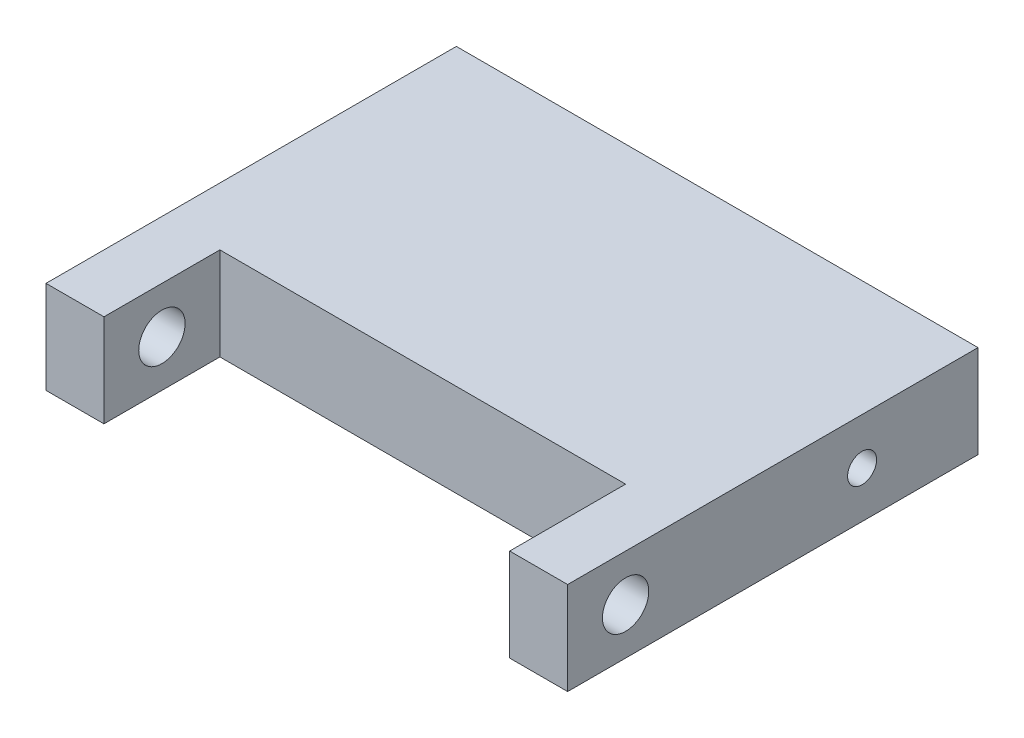
ISO-10303-21;
HEADER;
FILE_DESCRIPTION(('STEP AP214'),'2;1');
FILE_NAME('part.step','',(''),(''),'','','');
FILE_SCHEMA(('AUTOMOTIVE_DESIGN { 1 0 10303 214 1 1 1 1 }'));
ENDSEC;
DATA;
#1=APPLICATION_CONTEXT('core data for automotive mechanical design processes');
#2=APPLICATION_PROTOCOL_DEFINITION('international standard','automotive_design',2000,#1);
#3=PRODUCT_CONTEXT('',#1,'mechanical');
#4=PRODUCT('Part','Part','',(#3));
#5=PRODUCT_RELATED_PRODUCT_CATEGORY('part','',(#4));
#6=PRODUCT_DEFINITION_FORMATION('','',#4);
#7=PRODUCT_DEFINITION_CONTEXT('part definition',#1,'design');
#8=PRODUCT_DEFINITION('design','',#6,#7);
#9=PRODUCT_DEFINITION_SHAPE('','',#8);
#10=(LENGTH_UNIT() NAMED_UNIT(*) SI_UNIT(.MILLI.,.METRE.));
#11=(NAMED_UNIT(*) PLANE_ANGLE_UNIT() SI_UNIT($,.RADIAN.));
#12=(NAMED_UNIT(*) SI_UNIT($,.STERADIAN.) SOLID_ANGLE_UNIT());
#13=UNCERTAINTY_MEASURE_WITH_UNIT(LENGTH_MEASURE(1.E-05),#10,'distance_accuracy_value','');
#14=(GEOMETRIC_REPRESENTATION_CONTEXT(3) GLOBAL_UNCERTAINTY_ASSIGNED_CONTEXT((#13)) GLOBAL_UNIT_ASSIGNED_CONTEXT((#10,
#11,#12)) REPRESENTATION_CONTEXT('',''));
#15=CARTESIAN_POINT('',(0.,0.,0.));
#16=DIRECTION('',(0.,0.,1.));
#17=DIRECTION('',(1.,0.,0.));
#18=AXIS2_PLACEMENT_3D('',#15,#16,#17);
#19=CARTESIAN_POINT('',(0.,8.,0.));
#20=DIRECTION('',(0.,0.,-1.));
#21=DIRECTION('',(-1.,0.,0.));
#22=AXIS2_PLACEMENT_3D('',#19,#20,#21);
#23=PLANE('',#22);
#24=DIRECTION('',(0.,1.,0.));
#25=VECTOR('',#24,1.);
#26=CARTESIAN_POINT('',(5.,0.,0.));
#27=LINE('',#26,#25);
#28=CARTESIAN_POINT('',(5.,0.,0.));
#29=VERTEX_POINT('',#28);
#30=CARTESIAN_POINT('',(5.,8.,0.));
#31=VERTEX_POINT('',#30);
#32=EDGE_CURVE('E118',#29,#31,#27,.T.);
#33=ORIENTED_EDGE('',*,*,#32,.F.);
#34=DIRECTION('',(1.,0.,0.));
#35=VECTOR('',#34,1.);
#36=CARTESIAN_POINT('',(0.,0.,0.));
#37=LINE('',#36,#35);
#38=CARTESIAN_POINT('',(40.,0.,0.));
#39=VERTEX_POINT('',#38);
#40=EDGE_CURVE('E160',#29,#39,#37,.T.);
#41=ORIENTED_EDGE('',*,*,#40,.T.);
#42=DIRECTION('',(0.,-1.,0.));
#43=VECTOR('',#42,1.);
#44=CARTESIAN_POINT('',(40.,0.,0.));
#45=LINE('',#44,#43);
#46=CARTESIAN_POINT('',(40.,8.,0.));
#47=VERTEX_POINT('',#46);
#48=EDGE_CURVE('E132',#47,#39,#45,.T.);
#49=ORIENTED_EDGE('',*,*,#48,.F.);
#50=DIRECTION('',(1.,0.,0.));
#51=VECTOR('',#50,1.);
#52=CARTESIAN_POINT('',(0.,8.,0.));
#53=LINE('',#52,#51);
#54=EDGE_CURVE('E50',#31,#47,#53,.T.);
#55=ORIENTED_EDGE('',*,*,#54,.F.);
#56=EDGE_LOOP('',(#33,#41,#49,#55));
#57=FACE_BOUND('',#56,.T.);
#58=ADVANCED_FACE('F34',(#57),#23,.F.);
#59=CARTESIAN_POINT('',(0.,8.,0.));
#60=DIRECTION('',(1.,0.,0.));
#61=DIRECTION('',(0.,0.,-1.));
#62=AXIS2_PLACEMENT_3D('',#59,#60,#61);
#63=PLANE('',#62);
#64=CARTESIAN_POINT('',(0.,4.,-15.4));
#65=DIRECTION('',(-1.,0.,0.));
#66=DIRECTION('',(0.,0.,1.));
#67=AXIS2_PLACEMENT_3D('',#64,#65,#66);
#68=CIRCLE('',#67,1.25);
#69=CARTESIAN_POINT('',(0.,4.,-14.15));
#70=VERTEX_POINT('',#69);
#71=EDGE_CURVE('E186',#70,#70,#68,.T.);
#72=ORIENTED_EDGE('',*,*,#71,.F.);
#73=EDGE_LOOP('',(#72));
#74=FACE_BOUND('',#73,.T.);
#75=CARTESIAN_POINT('',(0.,4.,5.));
#76=DIRECTION('',(-1.,0.,0.));
#77=DIRECTION('',(0.,0.,1.));
#78=AXIS2_PLACEMENT_3D('',#75,#76,#77);
#79=CIRCLE('',#78,2.);
#80=CARTESIAN_POINT('',(0.,4.,7.));
#81=VERTEX_POINT('',#80);
#82=EDGE_CURVE('E177',#81,#81,#79,.T.);
#83=ORIENTED_EDGE('',*,*,#82,.F.);
#84=EDGE_LOOP('',(#83));
#85=FACE_BOUND('',#84,.T.);
#86=DIRECTION('',(0.,0.,1.));
#87=VECTOR('',#86,1.);
#88=CARTESIAN_POINT('',(0.,0.,0.));
#89=LINE('',#88,#87);
#90=CARTESIAN_POINT('',(0.,0.,-25.4));
#91=VERTEX_POINT('',#90);
#92=CARTESIAN_POINT('',(0.,0.,10.));
#93=VERTEX_POINT('',#92);
#94=EDGE_CURVE('E151',#91,#93,#89,.T.);
#95=ORIENTED_EDGE('',*,*,#94,.T.);
#96=DIRECTION('',(0.,-1.,0.));
#97=VECTOR('',#96,1.);
#98=CARTESIAN_POINT('',(0.,0.,10.));
#99=LINE('',#98,#97);
#100=CARTESIAN_POINT('',(0.,8.,10.));
#101=VERTEX_POINT('',#100);
#102=EDGE_CURVE('E108',#101,#93,#99,.T.);
#103=ORIENTED_EDGE('',*,*,#102,.F.);
#104=DIRECTION('',(0.,0.,1.));
#105=VECTOR('',#104,1.);
#106=CARTESIAN_POINT('',(0.,8.,0.));
#107=LINE('',#106,#105);
#108=CARTESIAN_POINT('',(0.,8.,-25.4));
#109=VERTEX_POINT('',#108);
#110=EDGE_CURVE('E104',#109,#101,#107,.T.);
#111=ORIENTED_EDGE('',*,*,#110,.F.);
#112=DIRECTION('',(0.,-1.,0.));
#113=VECTOR('',#112,1.);
#114=CARTESIAN_POINT('',(0.,8.,-25.4));
#115=LINE('',#114,#113);
#116=EDGE_CURVE('E43',#109,#91,#115,.T.);
#117=ORIENTED_EDGE('',*,*,#116,.T.);
#118=EDGE_LOOP('',(#95,#103,#111,#117));
#119=FACE_BOUND('',#118,.T.);
#120=ADVANCED_FACE('F36',(#74,#85,#119),#63,.F.);
#121=CARTESIAN_POINT('',(45.,8.,0.));
#122=DIRECTION('',(-1.,0.,0.));
#123=DIRECTION('',(0.,0.,1.));
#124=AXIS2_PLACEMENT_3D('',#121,#122,#123);
#125=PLANE('',#124);
#126=CARTESIAN_POINT('',(45.,4.,-15.4));
#127=DIRECTION('',(-1.,0.,0.));
#128=DIRECTION('',(0.,0.,1.));
#129=AXIS2_PLACEMENT_3D('',#126,#127,#128);
#130=CIRCLE('',#129,1.25);
#131=CARTESIAN_POINT('',(45.,4.,-14.15));
#132=VERTEX_POINT('',#131);
#133=EDGE_CURVE('E190',#132,#132,#130,.T.);
#134=ORIENTED_EDGE('',*,*,#133,.T.);
#135=EDGE_LOOP('',(#134));
#136=FACE_BOUND('',#135,.T.);
#137=CARTESIAN_POINT('',(45.,4.,5.));
#138=DIRECTION('',(-1.,0.,0.));
#139=DIRECTION('',(0.,0.,1.));
#140=AXIS2_PLACEMENT_3D('',#137,#138,#139);
#141=CIRCLE('',#140,2.);
#142=CARTESIAN_POINT('',(45.,4.,7.));
#143=VERTEX_POINT('',#142);
#144=EDGE_CURVE('E125',#143,#143,#141,.T.);
#145=ORIENTED_EDGE('',*,*,#144,.T.);
#146=EDGE_LOOP('',(#145));
#147=FACE_BOUND('',#146,.T.);
#148=DIRECTION('',(0.,0.,-1.));
#149=VECTOR('',#148,1.);
#150=CARTESIAN_POINT('',(45.,0.,0.));
#151=LINE('',#150,#149);
#152=CARTESIAN_POINT('',(45.,0.,10.));
#153=VERTEX_POINT('',#152);
#154=CARTESIAN_POINT('',(45.,0.,-25.4));
#155=VERTEX_POINT('',#154);
#156=EDGE_CURVE('E162',#153,#155,#151,.T.);
#157=ORIENTED_EDGE('',*,*,#156,.T.);
#158=DIRECTION('',(0.,-1.,0.));
#159=VECTOR('',#158,1.);
#160=CARTESIAN_POINT('',(45.,8.,-25.4));
#161=LINE('',#160,#159);
#162=CARTESIAN_POINT('',(45.,8.,-25.4));
#163=VERTEX_POINT('',#162);
#164=EDGE_CURVE('E11',#163,#155,#161,.T.);
#165=ORIENTED_EDGE('',*,*,#164,.F.);
#166=DIRECTION('',(0.,0.,-1.));
#167=VECTOR('',#166,1.);
#168=CARTESIAN_POINT('',(45.,8.,0.));
#169=LINE('',#168,#167);
#170=CARTESIAN_POINT('',(45.,8.,10.));
#171=VERTEX_POINT('',#170);
#172=EDGE_CURVE('E155',#171,#163,#169,.T.);
#173=ORIENTED_EDGE('',*,*,#172,.F.);
#174=DIRECTION('',(0.,1.,0.));
#175=VECTOR('',#174,1.);
#176=CARTESIAN_POINT('',(45.,0.,10.));
#177=LINE('',#176,#175);
#178=EDGE_CURVE('E133',#153,#171,#177,.T.);
#179=ORIENTED_EDGE('',*,*,#178,.F.);
#180=EDGE_LOOP('',(#157,#165,#173,#179));
#181=FACE_BOUND('',#180,.T.);
#182=ADVANCED_FACE('F198',(#136,#147,#181),#125,.F.);
#183=CARTESIAN_POINT('',(0.,8.,-25.4));
#184=DIRECTION('',(0.,0.,1.));
#185=DIRECTION('',(1.,0.,0.));
#186=AXIS2_PLACEMENT_3D('',#183,#184,#185);
#187=PLANE('',#186);
#188=DIRECTION('',(-1.,0.,0.));
#189=VECTOR('',#188,1.);
#190=CARTESIAN_POINT('',(0.,0.,-25.4));
#191=LINE('',#190,#189);
#192=EDGE_CURVE('E153',#155,#91,#191,.T.);
#193=ORIENTED_EDGE('',*,*,#192,.T.);
#194=ORIENTED_EDGE('',*,*,#116,.F.);
#195=DIRECTION('',(-1.,0.,0.));
#196=VECTOR('',#195,1.);
#197=CARTESIAN_POINT('',(0.,8.,-25.4));
#198=LINE('',#197,#196);
#199=EDGE_CURVE('E157',#163,#109,#198,.T.);
#200=ORIENTED_EDGE('',*,*,#199,.F.);
#201=ORIENTED_EDGE('',*,*,#164,.T.);
#202=EDGE_LOOP('',(#193,#194,#200,#201));
#203=FACE_BOUND('',#202,.T.);
#204=ADVANCED_FACE('F222',(#203),#187,.F.);
#205=CARTESIAN_POINT('',(0.,8.,0.));
#206=DIRECTION('',(0.,-1.,0.));
#207=DIRECTION('',(0.,0.,-1.));
#208=AXIS2_PLACEMENT_3D('',#205,#206,#207);
#209=PLANE('',#208);
#210=ORIENTED_EDGE('',*,*,#110,.T.);
#211=DIRECTION('',(-1.,0.,0.));
#212=VECTOR('',#211,1.);
#213=CARTESIAN_POINT('',(5.,8.,10.));
#214=LINE('',#213,#212);
#215=CARTESIAN_POINT('',(5.,8.,10.));
#216=VERTEX_POINT('',#215);
#217=EDGE_CURVE('E97',#216,#101,#214,.T.);
#218=ORIENTED_EDGE('',*,*,#217,.F.);
#219=DIRECTION('',(0.,0.,-1.));
#220=VECTOR('',#219,1.);
#221=CARTESIAN_POINT('',(5.,8.,10.));
#222=LINE('',#221,#220);
#223=EDGE_CURVE('E101',#216,#31,#222,.T.);
#224=ORIENTED_EDGE('',*,*,#223,.T.);
#225=ORIENTED_EDGE('',*,*,#54,.T.);
#226=DIRECTION('',(0.,0.,-1.));
#227=VECTOR('',#226,1.);
#228=CARTESIAN_POINT('',(40.,8.,10.));
#229=LINE('',#228,#227);
#230=CARTESIAN_POINT('',(40.,8.,10.));
#231=VERTEX_POINT('',#230);
#232=EDGE_CURVE('E148',#231,#47,#229,.T.);
#233=ORIENTED_EDGE('',*,*,#232,.F.);
#234=DIRECTION('',(-1.,0.,0.));
#235=VECTOR('',#234,1.);
#236=CARTESIAN_POINT('',(45.,8.,10.));
#237=LINE('',#236,#235);
#238=EDGE_CURVE('E136',#171,#231,#237,.T.);
#239=ORIENTED_EDGE('',*,*,#238,.F.);
#240=ORIENTED_EDGE('',*,*,#172,.T.);
#241=ORIENTED_EDGE('',*,*,#199,.T.);
#242=EDGE_LOOP('',(#210,#218,#224,#225,#233,#239,#240,#241));
#243=FACE_BOUND('',#242,.T.);
#244=ADVANCED_FACE('F99',(#243),#209,.F.);
#245=CARTESIAN_POINT('',(0.,0.,0.));
#246=DIRECTION('',(0.,-1.,0.));
#247=DIRECTION('',(0.,0.,-1.));
#248=AXIS2_PLACEMENT_3D('',#245,#246,#247);
#249=PLANE('',#248);
#250=ORIENTED_EDGE('',*,*,#94,.F.);
#251=ORIENTED_EDGE('',*,*,#192,.F.);
#252=ORIENTED_EDGE('',*,*,#156,.F.);
#253=DIRECTION('',(1.,0.,0.));
#254=VECTOR('',#253,1.);
#255=CARTESIAN_POINT('',(45.,0.,10.));
#256=LINE('',#255,#254);
#257=CARTESIAN_POINT('',(40.,0.,10.));
#258=VERTEX_POINT('',#257);
#259=EDGE_CURVE('E140',#258,#153,#256,.T.);
#260=ORIENTED_EDGE('',*,*,#259,.F.);
#261=DIRECTION('',(0.,0.,-1.));
#262=VECTOR('',#261,1.);
#263=CARTESIAN_POINT('',(40.,0.,10.));
#264=LINE('',#263,#262);
#265=EDGE_CURVE('E143',#258,#39,#264,.T.);
#266=ORIENTED_EDGE('',*,*,#265,.T.);
#267=ORIENTED_EDGE('',*,*,#40,.F.);
#268=DIRECTION('',(0.,0.,-1.));
#269=VECTOR('',#268,1.);
#270=CARTESIAN_POINT('',(5.,0.,10.));
#271=LINE('',#270,#269);
#272=CARTESIAN_POINT('',(5.,0.,10.));
#273=VERTEX_POINT('',#272);
#274=EDGE_CURVE('E122',#273,#29,#271,.T.);
#275=ORIENTED_EDGE('',*,*,#274,.F.);
#276=DIRECTION('',(1.,0.,0.));
#277=VECTOR('',#276,1.);
#278=CARTESIAN_POINT('',(5.,0.,10.));
#279=LINE('',#278,#277);
#280=EDGE_CURVE('E114',#93,#273,#279,.T.);
#281=ORIENTED_EDGE('',*,*,#280,.F.);
#282=EDGE_LOOP('',(#250,#251,#252,#260,#266,#267,#275,#281));
#283=FACE_BOUND('',#282,.T.);
#284=ADVANCED_FACE('F173',(#283),#249,.T.);
#285=CARTESIAN_POINT('',(40.,0.,10.));
#286=DIRECTION('',(1.,0.,0.));
#287=DIRECTION('',(0.,0.,-1.));
#288=AXIS2_PLACEMENT_3D('',#285,#286,#287);
#289=PLANE('',#288);
#290=CARTESIAN_POINT('',(40.,4.,5.));
#291=DIRECTION('',(-1.,0.,0.));
#292=DIRECTION('',(0.,0.,1.));
#293=AXIS2_PLACEMENT_3D('',#290,#291,#292);
#294=CIRCLE('',#293,2.);
#295=CARTESIAN_POINT('',(40.,4.,7.));
#296=VERTEX_POINT('',#295);
#297=EDGE_CURVE('E121',#296,#296,#294,.T.);
#298=ORIENTED_EDGE('',*,*,#297,.F.);
#299=EDGE_LOOP('',(#298));
#300=FACE_BOUND('',#299,.T.);
#301=ORIENTED_EDGE('',*,*,#48,.T.);
#302=ORIENTED_EDGE('',*,*,#265,.F.);
#303=DIRECTION('',(0.,-1.,0.));
#304=VECTOR('',#303,1.);
#305=CARTESIAN_POINT('',(40.,0.,10.));
#306=LINE('',#305,#304);
#307=EDGE_CURVE('E138',#231,#258,#306,.T.);
#308=ORIENTED_EDGE('',*,*,#307,.F.);
#309=ORIENTED_EDGE('',*,*,#232,.T.);
#310=EDGE_LOOP('',(#301,#302,#308,#309));
#311=FACE_BOUND('',#310,.T.);
#312=ADVANCED_FACE('F227',(#300,#311),#289,.F.);
#313=CARTESIAN_POINT('',(0.,0.,10.));
#314=DIRECTION('',(0.,0.,1.));
#315=DIRECTION('',(1.,0.,0.));
#316=AXIS2_PLACEMENT_3D('',#313,#314,#315);
#317=PLANE('',#316);
#318=ORIENTED_EDGE('',*,*,#178,.T.);
#319=ORIENTED_EDGE('',*,*,#238,.T.);
#320=ORIENTED_EDGE('',*,*,#307,.T.);
#321=ORIENTED_EDGE('',*,*,#259,.T.);
#322=EDGE_LOOP('',(#318,#319,#320,#321));
#323=FACE_BOUND('',#322,.T.);
#324=ADVANCED_FACE('F232',(#323),#317,.T.);
#325=CARTESIAN_POINT('',(70.,4.,5.));
#326=DIRECTION('',(-1.,0.,0.));
#327=DIRECTION('',(0.,0.,1.));
#328=AXIS2_PLACEMENT_3D('',#325,#326,#327);
#329=CYLINDRICAL_SURFACE('',#328,2.);
#330=ORIENTED_EDGE('',*,*,#297,.T.);
#331=EDGE_LOOP('',(#330));
#332=FACE_BOUND('',#331,.T.);
#333=ORIENTED_EDGE('',*,*,#144,.F.);
#334=EDGE_LOOP('',(#333));
#335=FACE_BOUND('',#334,.T.);
#336=ADVANCED_FACE('F236',(#332,#335),#329,.F.);
#337=CARTESIAN_POINT('',(5.,0.,10.));
#338=DIRECTION('',(-1.,0.,0.));
#339=DIRECTION('',(0.,0.,1.));
#340=AXIS2_PLACEMENT_3D('',#337,#338,#339);
#341=PLANE('',#340);
#342=CARTESIAN_POINT('',(5.,4.,5.));
#343=DIRECTION('',(-1.,0.,0.));
#344=DIRECTION('',(0.,0.,1.));
#345=AXIS2_PLACEMENT_3D('',#342,#343,#344);
#346=CIRCLE('',#345,2.);
#347=CARTESIAN_POINT('',(5.,4.,7.));
#348=VERTEX_POINT('',#347);
#349=EDGE_CURVE('E38',#348,#348,#346,.T.);
#350=ORIENTED_EDGE('',*,*,#349,.T.);
#351=EDGE_LOOP('',(#350));
#352=FACE_BOUND('',#351,.T.);
#353=ORIENTED_EDGE('',*,*,#32,.T.);
#354=ORIENTED_EDGE('',*,*,#223,.F.);
#355=DIRECTION('',(0.,1.,0.));
#356=VECTOR('',#355,1.);
#357=CARTESIAN_POINT('',(5.,0.,10.));
#358=LINE('',#357,#356);
#359=EDGE_CURVE('E109',#273,#216,#358,.T.);
#360=ORIENTED_EDGE('',*,*,#359,.F.);
#361=ORIENTED_EDGE('',*,*,#274,.T.);
#362=EDGE_LOOP('',(#353,#354,#360,#361));
#363=FACE_BOUND('',#362,.T.);
#364=ADVANCED_FACE('F120',(#352,#363),#341,.F.);
#365=CARTESIAN_POINT('',(-40.,0.,10.));
#366=DIRECTION('',(0.,0.,1.));
#367=DIRECTION('',(1.,0.,0.));
#368=AXIS2_PLACEMENT_3D('',#365,#366,#367);
#369=PLANE('',#368);
#370=ORIENTED_EDGE('',*,*,#359,.T.);
#371=ORIENTED_EDGE('',*,*,#217,.T.);
#372=ORIENTED_EDGE('',*,*,#102,.T.);
#373=ORIENTED_EDGE('',*,*,#280,.T.);
#374=EDGE_LOOP('',(#370,#371,#372,#373));
#375=FACE_BOUND('',#374,.T.);
#376=ADVANCED_FACE('F112',(#375),#369,.T.);
#377=CARTESIAN_POINT('',(30.,4.,5.));
#378=DIRECTION('',(-1.,0.,0.));
#379=DIRECTION('',(0.,0.,1.));
#380=AXIS2_PLACEMENT_3D('',#377,#378,#379);
#381=CYLINDRICAL_SURFACE('',#380,2.);
#382=ORIENTED_EDGE('',*,*,#82,.T.);
#383=EDGE_LOOP('',(#382));
#384=FACE_BOUND('',#383,.T.);
#385=ORIENTED_EDGE('',*,*,#349,.F.);
#386=EDGE_LOOP('',(#385));
#387=FACE_BOUND('',#386,.T.);
#388=ADVANCED_FACE('F245',(#384,#387),#381,.F.);
#389=CARTESIAN_POINT('',(8.,4.,-15.4));
#390=DIRECTION('',(-1.,0.,0.));
#391=DIRECTION('',(0.,0.,1.));
#392=AXIS2_PLACEMENT_3D('',#389,#390,#391);
#393=CYLINDRICAL_SURFACE('',#392,1.25);
#394=CARTESIAN_POINT('',(8.,4.,-15.4));
#395=DIRECTION('',(-1.,0.,0.));
#396=DIRECTION('',(0.,0.,1.));
#397=AXIS2_PLACEMENT_3D('',#394,#395,#396);
#398=CIRCLE('',#397,1.25);
#399=CARTESIAN_POINT('',(8.,4.,-14.15));
#400=VERTEX_POINT('',#399);
#401=EDGE_CURVE('E181',#400,#400,#398,.T.);
#402=ORIENTED_EDGE('',*,*,#401,.F.);
#403=EDGE_LOOP('',(#402));
#404=FACE_BOUND('',#403,.T.);
#405=ORIENTED_EDGE('',*,*,#71,.T.);
#406=EDGE_LOOP('',(#405));
#407=FACE_BOUND('',#406,.T.);
#408=ADVANCED_FACE('F248',(#404,#407),#393,.F.);
#409=CARTESIAN_POINT('',(8.,4.,-15.4));
#410=DIRECTION('',(-1.,0.,0.));
#411=DIRECTION('',(0.,0.,1.));
#412=AXIS2_PLACEMENT_3D('',#409,#410,#411);
#413=PLANE('',#412);
#414=ORIENTED_EDGE('',*,*,#401,.T.);
#415=EDGE_LOOP('',(#414));
#416=FACE_BOUND('',#415,.T.);
#417=ADVANCED_FACE('F205',(#416),#413,.T.);
#418=CARTESIAN_POINT('',(45.,4.,-15.4));
#419=DIRECTION('',(-1.,0.,0.));
#420=DIRECTION('',(0.,0.,1.));
#421=AXIS2_PLACEMENT_3D('',#418,#419,#420);
#422=CYLINDRICAL_SURFACE('',#421,1.25);
#423=ORIENTED_EDGE('',*,*,#133,.F.);
#424=EDGE_LOOP('',(#423));
#425=FACE_BOUND('',#424,.T.);
#426=CARTESIAN_POINT('',(37.,4.,-15.4));
#427=DIRECTION('',(-1.,0.,0.));
#428=DIRECTION('',(0.,0.,1.));
#429=AXIS2_PLACEMENT_3D('',#426,#427,#428);
#430=CIRCLE('',#429,1.25);
#431=CARTESIAN_POINT('',(37.,4.,-14.15));
#432=VERTEX_POINT('',#431);
#433=EDGE_CURVE('E192',#432,#432,#430,.T.);
#434=ORIENTED_EDGE('',*,*,#433,.T.);
#435=EDGE_LOOP('',(#434));
#436=FACE_BOUND('',#435,.T.);
#437=ADVANCED_FACE('F201',(#425,#436),#422,.F.);
#438=CARTESIAN_POINT('',(37.,4.,-15.4));
#439=DIRECTION('',(-1.,0.,0.));
#440=DIRECTION('',(0.,0.,1.));
#441=AXIS2_PLACEMENT_3D('',#438,#439,#440);
#442=PLANE('',#441);
#443=ORIENTED_EDGE('',*,*,#433,.F.);
#444=EDGE_LOOP('',(#443));
#445=FACE_BOUND('',#444,.T.);
#446=ADVANCED_FACE('F204',(#445),#442,.F.);
#447=CLOSED_SHELL('',(#58,#120,#182,#204,#244,#284,#312,#324,#336,#364,#376,#388,#408,#417,#437,#446));
#448=MANIFOLD_SOLID_BREP('B2',#447);
#449=ADVANCED_BREP_SHAPE_REPRESENTATION('',(#18,#448),#14);
#450=SHAPE_DEFINITION_REPRESENTATION(#9,#449);
ENDSEC;
END-ISO-10303-21;
